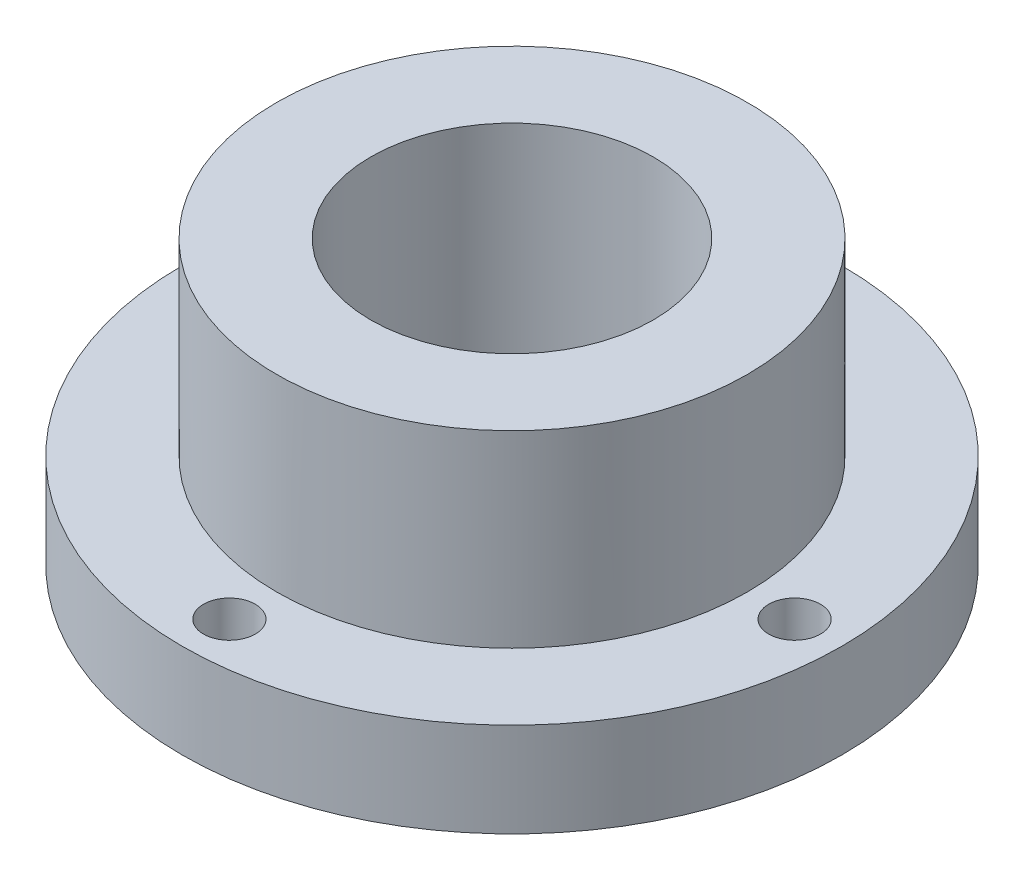
ISO-10303-21;
HEADER;
FILE_DESCRIPTION(('STEP AP214'),'2;1');
FILE_NAME('part.step','',(''),(''),'','','');
FILE_SCHEMA(('AUTOMOTIVE_DESIGN { 1 0 10303 214 1 1 1 1 }'));
ENDSEC;
DATA;
#1=APPLICATION_CONTEXT('core data for automotive mechanical design processes');
#2=APPLICATION_PROTOCOL_DEFINITION('international standard','automotive_design',2000,#1);
#3=PRODUCT_CONTEXT('',#1,'mechanical');
#4=PRODUCT('Part','Part','',(#3));
#5=PRODUCT_RELATED_PRODUCT_CATEGORY('part','',(#4));
#6=PRODUCT_DEFINITION_FORMATION('','',#4);
#7=PRODUCT_DEFINITION_CONTEXT('part definition',#1,'design');
#8=PRODUCT_DEFINITION('design','',#6,#7);
#9=PRODUCT_DEFINITION_SHAPE('','',#8);
#10=(LENGTH_UNIT() NAMED_UNIT(*) SI_UNIT(.MILLI.,.METRE.));
#11=(NAMED_UNIT(*) PLANE_ANGLE_UNIT() SI_UNIT($,.RADIAN.));
#12=(NAMED_UNIT(*) SI_UNIT($,.STERADIAN.) SOLID_ANGLE_UNIT());
#13=UNCERTAINTY_MEASURE_WITH_UNIT(LENGTH_MEASURE(1.E-05),#10,'distance_accuracy_value','');
#14=(GEOMETRIC_REPRESENTATION_CONTEXT(3) GLOBAL_UNCERTAINTY_ASSIGNED_CONTEXT((#13)) GLOBAL_UNIT_ASSIGNED_CONTEXT((#10,
#11,#12)) REPRESENTATION_CONTEXT('',''));
#15=CARTESIAN_POINT('',(0.,0.,0.));
#16=DIRECTION('',(0.,0.,1.));
#17=DIRECTION('',(1.,0.,0.));
#18=AXIS2_PLACEMENT_3D('',#15,#16,#17);
#19=CARTESIAN_POINT('',(0.,10.,0.));
#20=DIRECTION('',(0.,-1.,0.));
#21=DIRECTION('',(0.,0.,-1.));
#22=AXIS2_PLACEMENT_3D('',#19,#20,#21);
#23=CYLINDRICAL_SURFACE('',#22,35.);
#24=CARTESIAN_POINT('',(0.,10.,0.));
#25=DIRECTION('',(0.,1.,0.));
#26=DIRECTION('',(0.,0.,1.));
#27=AXIS2_PLACEMENT_3D('',#24,#25,#26);
#28=CIRCLE('',#27,35.);
#29=CARTESIAN_POINT('',(0.,10.,35.));
#30=VERTEX_POINT('',#29);
#31=EDGE_CURVE('E50',#30,#30,#28,.T.);
#32=ORIENTED_EDGE('',*,*,#31,.F.);
#33=EDGE_LOOP('',(#32));
#34=FACE_BOUND('',#33,.T.);
#35=CARTESIAN_POINT('',(0.,0.,0.));
#36=DIRECTION('',(0.,1.,0.));
#37=DIRECTION('',(0.,0.,1.));
#38=AXIS2_PLACEMENT_3D('',#35,#36,#37);
#39=CIRCLE('',#38,35.);
#40=CARTESIAN_POINT('',(0.,0.,35.));
#41=VERTEX_POINT('',#40);
#42=EDGE_CURVE('E46',#41,#41,#39,.T.);
#43=ORIENTED_EDGE('',*,*,#42,.T.);
#44=EDGE_LOOP('',(#43));
#45=FACE_BOUND('',#44,.T.);
#46=ADVANCED_FACE('F43',(#34,#45),#23,.T.);
#47=CARTESIAN_POINT('',(0.,10.,0.));
#48=DIRECTION('',(0.,1.,0.));
#49=DIRECTION('',(0.,0.,1.));
#50=AXIS2_PLACEMENT_3D('',#47,#48,#49);
#51=PLANE('',#50);
#52=CARTESIAN_POINT('',(30.,10.,0.));
#53=DIRECTION('',(0.,1.,0.));
#54=DIRECTION('',(0.,0.,1.));
#55=AXIS2_PLACEMENT_3D('',#52,#53,#54);
#56=CIRCLE('',#55,2.75000000000001);
#57=CARTESIAN_POINT('',(30.,10.,2.75000000000001));
#58=VERTEX_POINT('',#57);
#59=EDGE_CURVE('E83',#58,#58,#56,.T.);
#60=ORIENTED_EDGE('',*,*,#59,.F.);
#61=EDGE_LOOP('',(#60));
#62=FACE_BOUND('',#61,.T.);
#63=CARTESIAN_POINT('',(-1.04744440165294E-13,10.,30.));
#64=DIRECTION('',(0.,1.,0.));
#65=DIRECTION('',(0.,0.,1.));
#66=AXIS2_PLACEMENT_3D('',#63,#64,#65);
#67=CIRCLE('',#66,2.75000000000001);
#68=CARTESIAN_POINT('',(-1.04744440165294E-13,10.,32.75));
#69=VERTEX_POINT('',#68);
#70=EDGE_CURVE('E77',#69,#69,#67,.T.);
#71=ORIENTED_EDGE('',*,*,#70,.F.);
#72=EDGE_LOOP('',(#71));
#73=FACE_BOUND('',#72,.T.);
#74=CARTESIAN_POINT('',(-30.,10.,-2.09488880330588E-13));
#75=DIRECTION('',(0.,1.,0.));
#76=DIRECTION('',(0.,0.,1.));
#77=AXIS2_PLACEMENT_3D('',#74,#75,#76);
#78=CIRCLE('',#77,2.75000000000001);
#79=CARTESIAN_POINT('',(-30.,10.,2.7499999999998));
#80=VERTEX_POINT('',#79);
#81=EDGE_CURVE('E71',#80,#80,#78,.T.);
#82=ORIENTED_EDGE('',*,*,#81,.F.);
#83=EDGE_LOOP('',(#82));
#84=FACE_BOUND('',#83,.T.);
#85=CARTESIAN_POINT('',(3.14233320495882E-13,10.,-30.));
#86=DIRECTION('',(0.,1.,0.));
#87=DIRECTION('',(0.,0.,1.));
#88=AXIS2_PLACEMENT_3D('',#85,#86,#87);
#89=CIRCLE('',#88,2.75000000000001);
#90=CARTESIAN_POINT('',(3.14233320495882E-13,10.,-27.25));
#91=VERTEX_POINT('',#90);
#92=EDGE_CURVE('E65',#91,#91,#89,.T.);
#93=ORIENTED_EDGE('',*,*,#92,.F.);
#94=EDGE_LOOP('',(#93));
#95=FACE_BOUND('',#94,.T.);
#96=CARTESIAN_POINT('',(0.,10.,0.));
#97=DIRECTION('',(0.,1.,0.));
#98=DIRECTION('',(0.,0.,1.));
#99=AXIS2_PLACEMENT_3D('',#96,#97,#98);
#100=CIRCLE('',#99,25.);
#101=CARTESIAN_POINT('',(0.,10.,25.));
#102=VERTEX_POINT('',#101);
#103=EDGE_CURVE('E11',#102,#102,#100,.T.);
#104=ORIENTED_EDGE('',*,*,#103,.F.);
#105=EDGE_LOOP('',(#104));
#106=FACE_BOUND('',#105,.T.);
#107=ORIENTED_EDGE('',*,*,#31,.T.);
#108=EDGE_LOOP('',(#107));
#109=FACE_BOUND('',#108,.T.);
#110=ADVANCED_FACE('F112',(#62,#73,#84,#95,#106,#109),#51,.T.);
#111=CARTESIAN_POINT('',(0.,0.,0.));
#112=DIRECTION('',(0.,1.,0.));
#113=DIRECTION('',(0.,0.,1.));
#114=AXIS2_PLACEMENT_3D('',#111,#112,#113);
#115=PLANE('',#114);
#116=CARTESIAN_POINT('',(0.,0.,0.));
#117=DIRECTION('',(0.,1.,0.));
#118=DIRECTION('',(0.,0.,1.));
#119=AXIS2_PLACEMENT_3D('',#116,#117,#118);
#120=CIRCLE('',#119,15.);
#121=CARTESIAN_POINT('',(0.,0.,15.));
#122=VERTEX_POINT('',#121);
#123=EDGE_CURVE('E86',#122,#122,#120,.T.);
#124=ORIENTED_EDGE('',*,*,#123,.T.);
#125=EDGE_LOOP('',(#124));
#126=FACE_BOUND('',#125,.T.);
#127=CARTESIAN_POINT('',(30.,0.,0.));
#128=DIRECTION('',(0.,1.,0.));
#129=DIRECTION('',(0.,0.,1.));
#130=AXIS2_PLACEMENT_3D('',#127,#128,#129);
#131=CIRCLE('',#130,2.75000000000001);
#132=CARTESIAN_POINT('',(30.,0.,2.75000000000001));
#133=VERTEX_POINT('',#132);
#134=EDGE_CURVE('E80',#133,#133,#131,.T.);
#135=ORIENTED_EDGE('',*,*,#134,.T.);
#136=EDGE_LOOP('',(#135));
#137=FACE_BOUND('',#136,.T.);
#138=CARTESIAN_POINT('',(-1.04744440165294E-13,0.,30.));
#139=DIRECTION('',(0.,1.,0.));
#140=DIRECTION('',(0.,0.,1.));
#141=AXIS2_PLACEMENT_3D('',#138,#139,#140);
#142=CIRCLE('',#141,2.75000000000001);
#143=CARTESIAN_POINT('',(-1.04744440165294E-13,0.,32.75));
#144=VERTEX_POINT('',#143);
#145=EDGE_CURVE('E74',#144,#144,#142,.T.);
#146=ORIENTED_EDGE('',*,*,#145,.T.);
#147=EDGE_LOOP('',(#146));
#148=FACE_BOUND('',#147,.T.);
#149=CARTESIAN_POINT('',(-30.,0.,-2.09488880330588E-13));
#150=DIRECTION('',(0.,1.,0.));
#151=DIRECTION('',(0.,0.,1.));
#152=AXIS2_PLACEMENT_3D('',#149,#150,#151);
#153=CIRCLE('',#152,2.75000000000001);
#154=CARTESIAN_POINT('',(-30.,0.,2.7499999999998));
#155=VERTEX_POINT('',#154);
#156=EDGE_CURVE('E68',#155,#155,#153,.T.);
#157=ORIENTED_EDGE('',*,*,#156,.T.);
#158=EDGE_LOOP('',(#157));
#159=FACE_BOUND('',#158,.T.);
#160=CARTESIAN_POINT('',(3.14233320495882E-13,0.,-30.));
#161=DIRECTION('',(0.,1.,0.));
#162=DIRECTION('',(0.,0.,1.));
#163=AXIS2_PLACEMENT_3D('',#160,#161,#162);
#164=CIRCLE('',#163,2.75000000000001);
#165=CARTESIAN_POINT('',(3.14233320495882E-13,0.,-27.25));
#166=VERTEX_POINT('',#165);
#167=EDGE_CURVE('E62',#166,#166,#164,.T.);
#168=ORIENTED_EDGE('',*,*,#167,.T.);
#169=EDGE_LOOP('',(#168));
#170=FACE_BOUND('',#169,.T.);
#171=ORIENTED_EDGE('',*,*,#42,.F.);
#172=EDGE_LOOP('',(#171));
#173=FACE_BOUND('',#172,.T.);
#174=ADVANCED_FACE('F90',(#126,#137,#148,#159,#170,#173),#115,.F.);
#175=CARTESIAN_POINT('',(0.,30.,0.));
#176=DIRECTION('',(0.,-1.,0.));
#177=DIRECTION('',(0.,0.,-1.));
#178=AXIS2_PLACEMENT_3D('',#175,#176,#177);
#179=CYLINDRICAL_SURFACE('',#178,25.);
#180=ORIENTED_EDGE('',*,*,#103,.T.);
#181=EDGE_LOOP('',(#180));
#182=FACE_BOUND('',#181,.T.);
#183=CARTESIAN_POINT('',(0.,30.,0.));
#184=DIRECTION('',(0.,-1.,0.));
#185=DIRECTION('',(1.,0.,0.));
#186=AXIS2_PLACEMENT_3D('',#183,#184,#185);
#187=CIRCLE('',#186,25.);
#188=CARTESIAN_POINT('',(25.,30.,0.));
#189=VERTEX_POINT('',#188);
#190=EDGE_CURVE('E56',#189,#189,#187,.T.);
#191=ORIENTED_EDGE('',*,*,#190,.T.);
#192=EDGE_LOOP('',(#191));
#193=FACE_BOUND('',#192,.T.);
#194=ADVANCED_FACE('F107',(#182,#193),#179,.T.);
#195=CARTESIAN_POINT('',(0.,30.,0.));
#196=DIRECTION('',(0.,-1.,0.));
#197=DIRECTION('',(0.,0.,-1.));
#198=AXIS2_PLACEMENT_3D('',#195,#196,#197);
#199=PLANE('',#198);
#200=CARTESIAN_POINT('',(0.,30.,0.));
#201=DIRECTION('',(0.,-1.,0.));
#202=DIRECTION('',(0.,0.,-1.));
#203=AXIS2_PLACEMENT_3D('',#200,#201,#202);
#204=CIRCLE('',#203,15.);
#205=CARTESIAN_POINT('',(0.,30.,-15.));
#206=VERTEX_POINT('',#205);
#207=EDGE_CURVE('E59',#206,#206,#204,.T.);
#208=ORIENTED_EDGE('',*,*,#207,.T.);
#209=EDGE_LOOP('',(#208));
#210=FACE_BOUND('',#209,.T.);
#211=ORIENTED_EDGE('',*,*,#190,.F.);
#212=EDGE_LOOP('',(#211));
#213=FACE_BOUND('',#212,.T.);
#214=ADVANCED_FACE('F96',(#210,#213),#199,.F.);
#215=CARTESIAN_POINT('',(0.,30.,0.));
#216=DIRECTION('',(0.,-1.,0.));
#217=DIRECTION('',(0.,0.,-1.));
#218=AXIS2_PLACEMENT_3D('',#215,#216,#217);
#219=CYLINDRICAL_SURFACE('',#218,15.);
#220=ORIENTED_EDGE('',*,*,#207,.F.);
#221=EDGE_LOOP('',(#220));
#222=FACE_BOUND('',#221,.T.);
#223=ORIENTED_EDGE('',*,*,#123,.F.);
#224=EDGE_LOOP('',(#223));
#225=FACE_BOUND('',#224,.T.);
#226=ADVANCED_FACE('F93',(#222,#225),#219,.F.);
#227=CARTESIAN_POINT('',(3.14233320495882E-13,10.,-30.));
#228=DIRECTION('',(0.,1.,0.));
#229=DIRECTION('',(0.,0.,1.));
#230=AXIS2_PLACEMENT_3D('',#227,#228,#229);
#231=CYLINDRICAL_SURFACE('',#230,2.75000000000001);
#232=ORIENTED_EDGE('',*,*,#167,.F.);
#233=EDGE_LOOP('',(#232));
#234=FACE_BOUND('',#233,.T.);
#235=ORIENTED_EDGE('',*,*,#92,.T.);
#236=EDGE_LOOP('',(#235));
#237=FACE_BOUND('',#236,.T.);
#238=ADVANCED_FACE('F95',(#234,#237),#231,.F.);
#239=CARTESIAN_POINT('',(-30.,10.,-2.09488880330588E-13));
#240=DIRECTION('',(0.,1.,0.));
#241=DIRECTION('',(0.,0.,1.));
#242=AXIS2_PLACEMENT_3D('',#239,#240,#241);
#243=CYLINDRICAL_SURFACE('',#242,2.75000000000001);
#244=ORIENTED_EDGE('',*,*,#156,.F.);
#245=EDGE_LOOP('',(#244));
#246=FACE_BOUND('',#245,.T.);
#247=ORIENTED_EDGE('',*,*,#81,.T.);
#248=EDGE_LOOP('',(#247));
#249=FACE_BOUND('',#248,.T.);
#250=ADVANCED_FACE('F103',(#246,#249),#243,.F.);
#251=CARTESIAN_POINT('',(-1.04744440165294E-13,10.,30.));
#252=DIRECTION('',(0.,1.,0.));
#253=DIRECTION('',(0.,0.,1.));
#254=AXIS2_PLACEMENT_3D('',#251,#252,#253);
#255=CYLINDRICAL_SURFACE('',#254,2.75000000000001);
#256=ORIENTED_EDGE('',*,*,#145,.F.);
#257=EDGE_LOOP('',(#256));
#258=FACE_BOUND('',#257,.T.);
#259=ORIENTED_EDGE('',*,*,#70,.T.);
#260=EDGE_LOOP('',(#259));
#261=FACE_BOUND('',#260,.T.);
#262=ADVANCED_FACE('F157',(#258,#261),#255,.F.);
#263=CARTESIAN_POINT('',(30.,10.,0.));
#264=DIRECTION('',(0.,1.,0.));
#265=DIRECTION('',(0.,0.,1.));
#266=AXIS2_PLACEMENT_3D('',#263,#264,#265);
#267=CYLINDRICAL_SURFACE('',#266,2.75000000000001);
#268=ORIENTED_EDGE('',*,*,#134,.F.);
#269=EDGE_LOOP('',(#268));
#270=FACE_BOUND('',#269,.T.);
#271=ORIENTED_EDGE('',*,*,#59,.T.);
#272=EDGE_LOOP('',(#271));
#273=FACE_BOUND('',#272,.T.);
#274=ADVANCED_FACE('F165',(#270,#273),#267,.F.);
#275=CLOSED_SHELL('',(#46,#110,#174,#194,#214,#226,#238,#250,#262,#274));
#276=MANIFOLD_SOLID_BREP('B2',#275);
#277=ADVANCED_BREP_SHAPE_REPRESENTATION('',(#18,#276),#14);
#278=SHAPE_DEFINITION_REPRESENTATION(#9,#277);
ENDSEC;
END-ISO-10303-21;
